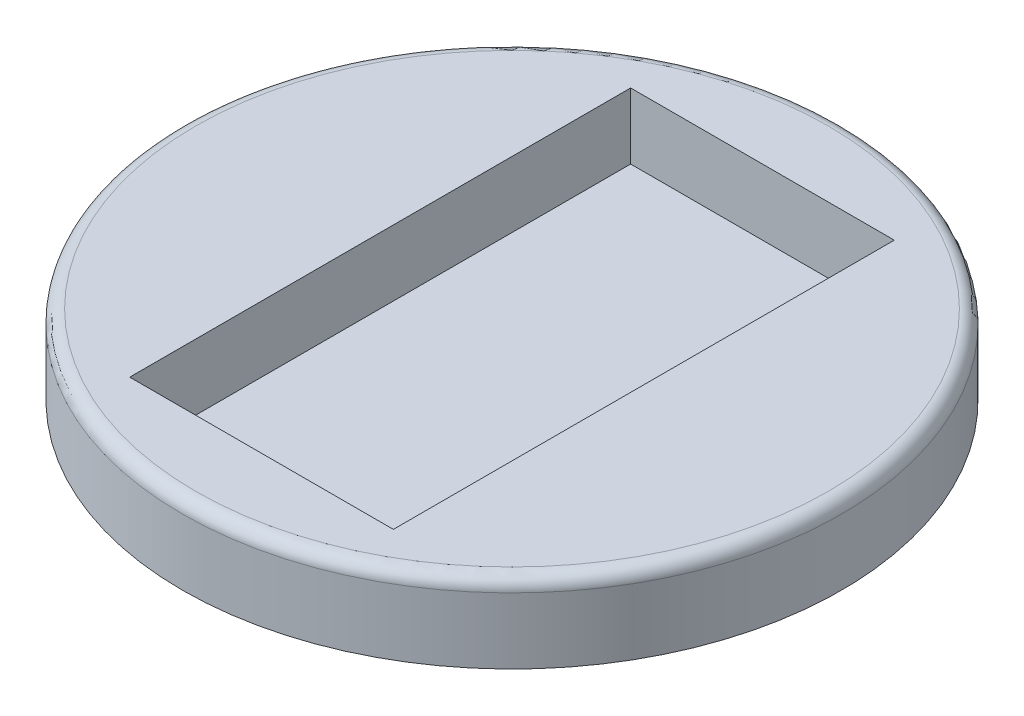
ISO-10303-21;
HEADER;
FILE_DESCRIPTION(('STEP AP214'),'2;1');
FILE_NAME('part.step','',(''),(''),'','','');
FILE_SCHEMA(('AUTOMOTIVE_DESIGN { 1 0 10303 214 1 1 1 1 }'));
ENDSEC;
DATA;
#1=APPLICATION_CONTEXT('core data for automotive mechanical design processes');
#2=APPLICATION_PROTOCOL_DEFINITION('international standard','automotive_design',2000,#1);
#3=PRODUCT_CONTEXT('',#1,'mechanical');
#4=PRODUCT('Part','Part','',(#3));
#5=PRODUCT_RELATED_PRODUCT_CATEGORY('part','',(#4));
#6=PRODUCT_DEFINITION_FORMATION('','',#4);
#7=PRODUCT_DEFINITION_CONTEXT('part definition',#1,'design');
#8=PRODUCT_DEFINITION('design','',#6,#7);
#9=PRODUCT_DEFINITION_SHAPE('','',#8);
#10=(LENGTH_UNIT() NAMED_UNIT(*) SI_UNIT(.MILLI.,.METRE.));
#11=(NAMED_UNIT(*) PLANE_ANGLE_UNIT() SI_UNIT($,.RADIAN.));
#12=(NAMED_UNIT(*) SI_UNIT($,.STERADIAN.) SOLID_ANGLE_UNIT());
#13=UNCERTAINTY_MEASURE_WITH_UNIT(LENGTH_MEASURE(1.E-05),#10,'distance_accuracy_value','');
#14=(GEOMETRIC_REPRESENTATION_CONTEXT(3) GLOBAL_UNCERTAINTY_ASSIGNED_CONTEXT((#13)) GLOBAL_UNIT_ASSIGNED_CONTEXT((#10,
#11,#12)) REPRESENTATION_CONTEXT('',''));
#15=CARTESIAN_POINT('',(0.,0.,0.));
#16=DIRECTION('',(0.,0.,1.));
#17=DIRECTION('',(1.,0.,0.));
#18=AXIS2_PLACEMENT_3D('',#15,#16,#17);
#19=CARTESIAN_POINT('',(0.,6.,0.));
#20=DIRECTION('',(0.,-1.,0.));
#21=DIRECTION('',(0.,0.,-1.));
#22=AXIS2_PLACEMENT_3D('',#19,#20,#21);
#23=CYLINDRICAL_SURFACE('',#22,25.);
#24=CARTESIAN_POINT('',(0.,5.,0.));
#25=DIRECTION('',(0.,1.,0.));
#26=DIRECTION('',(0.,0.,1.));
#27=AXIS2_PLACEMENT_3D('',#24,#25,#26);
#28=CIRCLE('',#27,25.);
#29=CARTESIAN_POINT('',(0.,5.,25.));
#30=VERTEX_POINT('',#29);
#31=EDGE_CURVE('E11',#30,#30,#28,.F.);
#32=ORIENTED_EDGE('',*,*,#31,.T.);
#33=EDGE_LOOP('',(#32));
#34=FACE_BOUND('',#33,.T.);
#35=CARTESIAN_POINT('',(0.,0.,0.));
#36=DIRECTION('',(0.,1.,0.));
#37=DIRECTION('',(0.,0.,1.));
#38=AXIS2_PLACEMENT_3D('',#35,#36,#37);
#39=CIRCLE('',#38,25.);
#40=CARTESIAN_POINT('',(0.,0.,25.));
#41=VERTEX_POINT('',#40);
#42=EDGE_CURVE('E109',#41,#41,#39,.T.);
#43=ORIENTED_EDGE('',*,*,#42,.T.);
#44=EDGE_LOOP('',(#43));
#45=FACE_BOUND('',#44,.T.);
#46=ADVANCED_FACE('F33',(#34,#45),#23,.T.);
#47=CARTESIAN_POINT('',(0.,6.,0.));
#48=DIRECTION('',(0.,1.,0.));
#49=DIRECTION('',(0.,0.,1.));
#50=AXIS2_PLACEMENT_3D('',#47,#48,#49);
#51=PLANE('',#50);
#52=CARTESIAN_POINT('',(0.,6.,0.));
#53=DIRECTION('',(0.,1.,0.));
#54=DIRECTION('',(0.,0.,1.));
#55=AXIS2_PLACEMENT_3D('',#52,#53,#54);
#56=CIRCLE('',#55,24.);
#57=CARTESIAN_POINT('',(0.,6.,24.));
#58=VERTEX_POINT('',#57);
#59=EDGE_CURVE('E41',#58,#58,#56,.T.);
#60=ORIENTED_EDGE('',*,*,#59,.T.);
#61=EDGE_LOOP('',(#60));
#62=FACE_BOUND('',#61,.T.);
#63=DIRECTION('',(0.,0.,-1.));
#64=VECTOR('',#63,1.);
#65=CARTESIAN_POINT('',(10.,6.,-19.));
#66=LINE('',#65,#64);
#67=CARTESIAN_POINT('',(10.,6.,19.));
#68=VERTEX_POINT('',#67);
#69=CARTESIAN_POINT('',(10.,6.,-19.));
#70=VERTEX_POINT('',#69);
#71=EDGE_CURVE('E48',#68,#70,#66,.T.);
#72=ORIENTED_EDGE('',*,*,#71,.F.);
#73=DIRECTION('',(1.,0.,0.));
#74=VECTOR('',#73,1.);
#75=CARTESIAN_POINT('',(-10.,6.,19.));
#76=LINE('',#75,#74);
#77=CARTESIAN_POINT('',(-10.,6.,19.));
#78=VERTEX_POINT('',#77);
#79=EDGE_CURVE('E99',#78,#68,#76,.T.);
#80=ORIENTED_EDGE('',*,*,#79,.F.);
#81=DIRECTION('',(0.,0.,1.));
#82=VECTOR('',#81,1.);
#83=CARTESIAN_POINT('',(-10.,6.,-19.));
#84=LINE('',#83,#82);
#85=CARTESIAN_POINT('',(-10.,6.,-19.));
#86=VERTEX_POINT('',#85);
#87=EDGE_CURVE('E105',#86,#78,#84,.T.);
#88=ORIENTED_EDGE('',*,*,#87,.F.);
#89=DIRECTION('',(-1.,0.,0.));
#90=VECTOR('',#89,1.);
#91=CARTESIAN_POINT('',(-10.,6.,-19.));
#92=LINE('',#91,#90);
#93=EDGE_CURVE('E83',#70,#86,#92,.T.);
#94=ORIENTED_EDGE('',*,*,#93,.F.);
#95=EDGE_LOOP('',(#72,#80,#88,#94));
#96=FACE_BOUND('',#95,.T.);
#97=ADVANCED_FACE('F116',(#62,#96),#51,.T.);
#98=CARTESIAN_POINT('',(0.,0.,0.));
#99=DIRECTION('',(0.,1.,0.));
#100=DIRECTION('',(0.,0.,1.));
#101=AXIS2_PLACEMENT_3D('',#98,#99,#100);
#102=PLANE('',#101);
#103=ORIENTED_EDGE('',*,*,#42,.F.);
#104=EDGE_LOOP('',(#103));
#105=FACE_BOUND('',#104,.T.);
#106=ADVANCED_FACE('F131',(#105),#102,.F.);
#107=CARTESIAN_POINT('',(10.,1.,-19.));
#108=DIRECTION('',(1.,0.,0.));
#109=DIRECTION('',(0.,0.,-1.));
#110=AXIS2_PLACEMENT_3D('',#107,#108,#109);
#111=PLANE('',#110);
#112=ORIENTED_EDGE('',*,*,#71,.T.);
#113=DIRECTION('',(0.,1.,0.));
#114=VECTOR('',#113,1.);
#115=CARTESIAN_POINT('',(10.,1.,-19.));
#116=LINE('',#115,#114);
#117=CARTESIAN_POINT('',(10.,1.,-19.));
#118=VERTEX_POINT('',#117);
#119=EDGE_CURVE('E71',#118,#70,#116,.T.);
#120=ORIENTED_EDGE('',*,*,#119,.F.);
#121=DIRECTION('',(0.,0.,-1.));
#122=VECTOR('',#121,1.);
#123=CARTESIAN_POINT('',(10.,1.,-19.));
#124=LINE('',#123,#122);
#125=CARTESIAN_POINT('',(10.,1.,19.));
#126=VERTEX_POINT('',#125);
#127=EDGE_CURVE('E97',#126,#118,#124,.T.);
#128=ORIENTED_EDGE('',*,*,#127,.F.);
#129=DIRECTION('',(0.,1.,0.));
#130=VECTOR('',#129,1.);
#131=CARTESIAN_POINT('',(10.,1.,19.));
#132=LINE('',#131,#130);
#133=EDGE_CURVE('E56',#126,#68,#132,.T.);
#134=ORIENTED_EDGE('',*,*,#133,.T.);
#135=EDGE_LOOP('',(#112,#120,#128,#134));
#136=FACE_BOUND('',#135,.T.);
#137=ADVANCED_FACE('F136',(#136),#111,.F.);
#138=CARTESIAN_POINT('',(-10.,1.,19.));
#139=DIRECTION('',(0.,0.,1.));
#140=DIRECTION('',(1.,0.,0.));
#141=AXIS2_PLACEMENT_3D('',#138,#139,#140);
#142=PLANE('',#141);
#143=ORIENTED_EDGE('',*,*,#79,.T.);
#144=ORIENTED_EDGE('',*,*,#133,.F.);
#145=DIRECTION('',(1.,0.,0.));
#146=VECTOR('',#145,1.);
#147=CARTESIAN_POINT('',(-10.,1.,19.));
#148=LINE('',#147,#146);
#149=CARTESIAN_POINT('',(-10.,1.,19.));
#150=VERTEX_POINT('',#149);
#151=EDGE_CURVE('E94',#150,#126,#148,.T.);
#152=ORIENTED_EDGE('',*,*,#151,.F.);
#153=DIRECTION('',(0.,1.,0.));
#154=VECTOR('',#153,1.);
#155=CARTESIAN_POINT('',(-10.,1.,19.));
#156=LINE('',#155,#154);
#157=EDGE_CURVE('E87',#150,#78,#156,.T.);
#158=ORIENTED_EDGE('',*,*,#157,.T.);
#159=EDGE_LOOP('',(#143,#144,#152,#158));
#160=FACE_BOUND('',#159,.T.);
#161=ADVANCED_FACE('F141',(#160),#142,.F.);
#162=CARTESIAN_POINT('',(-10.,1.,-19.));
#163=DIRECTION('',(-1.,0.,0.));
#164=DIRECTION('',(0.,0.,1.));
#165=AXIS2_PLACEMENT_3D('',#162,#163,#164);
#166=PLANE('',#165);
#167=ORIENTED_EDGE('',*,*,#87,.T.);
#168=ORIENTED_EDGE('',*,*,#157,.F.);
#169=DIRECTION('',(0.,0.,1.));
#170=VECTOR('',#169,1.);
#171=CARTESIAN_POINT('',(-10.,1.,-19.));
#172=LINE('',#171,#170);
#173=CARTESIAN_POINT('',(-10.,1.,-19.));
#174=VERTEX_POINT('',#173);
#175=EDGE_CURVE('E90',#174,#150,#172,.T.);
#176=ORIENTED_EDGE('',*,*,#175,.F.);
#177=DIRECTION('',(0.,1.,0.));
#178=VECTOR('',#177,1.);
#179=CARTESIAN_POINT('',(-10.,1.,-19.));
#180=LINE('',#179,#178);
#181=EDGE_CURVE('E76',#174,#86,#180,.T.);
#182=ORIENTED_EDGE('',*,*,#181,.T.);
#183=EDGE_LOOP('',(#167,#168,#176,#182));
#184=FACE_BOUND('',#183,.T.);
#185=ADVANCED_FACE('F91',(#184),#166,.F.);
#186=CARTESIAN_POINT('',(-10.,1.,-19.));
#187=DIRECTION('',(0.,0.,-1.));
#188=DIRECTION('',(-1.,0.,0.));
#189=AXIS2_PLACEMENT_3D('',#186,#187,#188);
#190=PLANE('',#189);
#191=ORIENTED_EDGE('',*,*,#93,.T.);
#192=ORIENTED_EDGE('',*,*,#181,.F.);
#193=DIRECTION('',(-1.,0.,0.));
#194=VECTOR('',#193,1.);
#195=CARTESIAN_POINT('',(-10.,1.,-19.));
#196=LINE('',#195,#194);
#197=EDGE_CURVE('E80',#118,#174,#196,.T.);
#198=ORIENTED_EDGE('',*,*,#197,.F.);
#199=ORIENTED_EDGE('',*,*,#119,.T.);
#200=EDGE_LOOP('',(#191,#192,#198,#199));
#201=FACE_BOUND('',#200,.T.);
#202=ADVANCED_FACE('F78',(#201),#190,.F.);
#203=CARTESIAN_POINT('',(0.,1.,0.));
#204=DIRECTION('',(0.,1.,0.));
#205=DIRECTION('',(0.,0.,1.));
#206=AXIS2_PLACEMENT_3D('',#203,#204,#205);
#207=PLANE('',#206);
#208=ORIENTED_EDGE('',*,*,#127,.T.);
#209=ORIENTED_EDGE('',*,*,#197,.T.);
#210=ORIENTED_EDGE('',*,*,#175,.T.);
#211=ORIENTED_EDGE('',*,*,#151,.T.);
#212=EDGE_LOOP('',(#208,#209,#210,#211));
#213=FACE_BOUND('',#212,.T.);
#214=ADVANCED_FACE('F96',(#213),#207,.T.);
#215=CARTESIAN_POINT('',(0.,5.,0.));
#216=DIRECTION('',(0.,1.,0.));
#217=DIRECTION('',(0.,0.,1.));
#218=AXIS2_PLACEMENT_3D('',#215,#216,#217);
#219=TOROIDAL_SURFACE('',#218,24.,1.);
#220=ORIENTED_EDGE('',*,*,#31,.F.);
#221=EDGE_LOOP('',(#220));
#222=FACE_BOUND('',#221,.T.);
#223=ORIENTED_EDGE('',*,*,#59,.F.);
#224=EDGE_LOOP('',(#223));
#225=FACE_BOUND('',#224,.T.);
#226=ADVANCED_FACE('F35',(#222,#225),#219,.T.);
#227=CLOSED_SHELL('',(#46,#97,#106,#137,#161,#185,#202,#214,#226));
#228=MANIFOLD_SOLID_BREP('B2',#227);
#229=ADVANCED_BREP_SHAPE_REPRESENTATION('',(#18,#228),#14);
#230=SHAPE_DEFINITION_REPRESENTATION(#9,#229);
ENDSEC;
END-ISO-10303-21;
